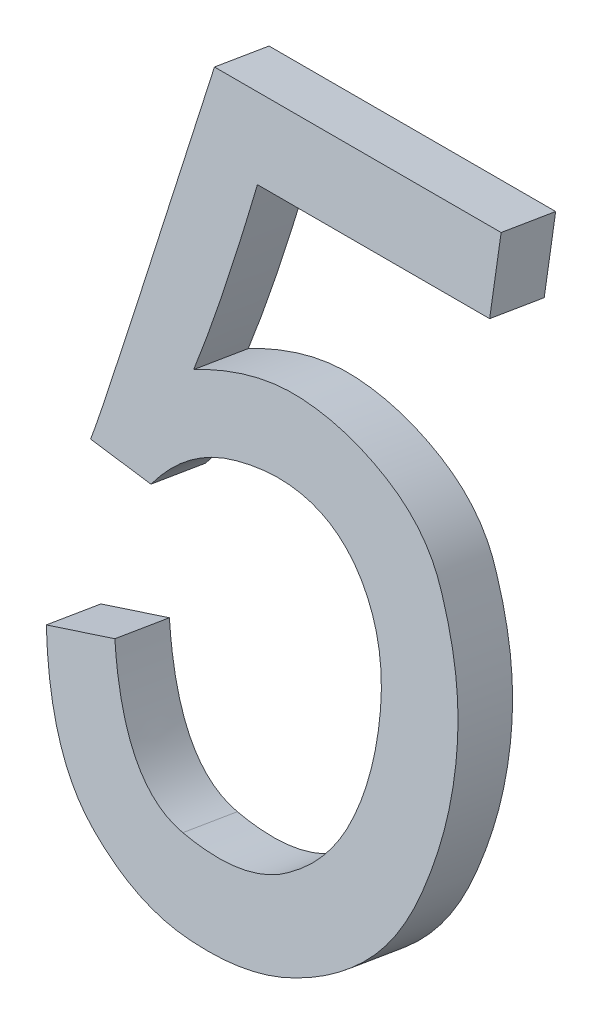
ISO-10303-21;
HEADER;
FILE_DESCRIPTION(('STEP AP214'),'2;1');
FILE_NAME('part.step','',(''),(''),'','','');
FILE_SCHEMA(('AUTOMOTIVE_DESIGN { 1 0 10303 214 1 1 1 1 }'));
ENDSEC;
DATA;
#1=APPLICATION_CONTEXT('core data for automotive mechanical design processes');
#2=APPLICATION_PROTOCOL_DEFINITION('international standard','automotive_design',2000,#1);
#3=PRODUCT_CONTEXT('',#1,'mechanical');
#4=PRODUCT('Part','Part','',(#3));
#5=PRODUCT_RELATED_PRODUCT_CATEGORY('part','',(#4));
#6=PRODUCT_DEFINITION_FORMATION('','',#4);
#7=PRODUCT_DEFINITION_CONTEXT('part definition',#1,'design');
#8=PRODUCT_DEFINITION('design','',#6,#7);
#9=PRODUCT_DEFINITION_SHAPE('','',#8);
#10=(LENGTH_UNIT() NAMED_UNIT(*) SI_UNIT(.MILLI.,.METRE.));
#11=(NAMED_UNIT(*) PLANE_ANGLE_UNIT() SI_UNIT($,.RADIAN.));
#12=(NAMED_UNIT(*) SI_UNIT($,.STERADIAN.) SOLID_ANGLE_UNIT());
#13=UNCERTAINTY_MEASURE_WITH_UNIT(LENGTH_MEASURE(1.E-05),#10,'distance_accuracy_value','');
#14=(GEOMETRIC_REPRESENTATION_CONTEXT(3) GLOBAL_UNCERTAINTY_ASSIGNED_CONTEXT((#13)) GLOBAL_UNIT_ASSIGNED_CONTEXT((#10,
#11,#12)) REPRESENTATION_CONTEXT('',''));
#15=CARTESIAN_POINT('',(0.,0.,0.));
#16=DIRECTION('',(0.,0.,1.));
#17=DIRECTION('',(1.,0.,0.));
#18=AXIS2_PLACEMENT_3D('',#15,#16,#17);
#19=CARTESIAN_POINT('',(1440.69351230425,1096.04138361752,1251.70115066223));
#20=CARTESIAN_POINT('',(1436.97762863534,1096.74208879472,1251.58436646603));
#21=CARTESIAN_POINT('',(1434.34451901566,1100.19371059353,1251.00909616622));
#22=CARTESIAN_POINT('',(1432.81879194631,1106.42220105754,1249.97101442222));
#23=B_SPLINE_CURVE_WITH_KNOTS('',3,(#19,#20,#21,#22),.UNSPECIFIED.,.F.,.F.,(4,4),(0.,
0.0340028100844146),.UNSPECIFIED.);
#24=DIRECTION('',(0.,-0.164398987305355,-0.986393923832144));
#25=VECTOR('',#24,1.);
#26=SURFACE_OF_LINEAR_EXTRUSION('',#23,#25);
#27=CARTESIAN_POINT('',(1440.69351230425,1095.21938868099,1246.76918104307));
#28=CARTESIAN_POINT('',(1436.97762863534,1095.9200938582,1246.65239684687));
#29=CARTESIAN_POINT('',(1434.34451901566,1099.371715657,1246.07712654706));
#30=CARTESIAN_POINT('',(1432.81879194631,1105.60020612102,1245.03904480306));
#31=B_SPLINE_CURVE_WITH_KNOTS('',3,(#27,#28,#29,#30),.UNSPECIFIED.,.F.,.F.,(4,4),(0.,
0.0340028100844146),.UNSPECIFIED.);
#32=CARTESIAN_POINT('',(1440.69351230425,1095.21938868099,1246.76918104307));
#33=VERTEX_POINT('',#32);
#34=CARTESIAN_POINT('',(1432.81879194631,1105.60020612102,1245.03904480306));
#35=VERTEX_POINT('',#34);
#36=EDGE_CURVE('E102',#33,#35,#31,.T.);
#37=ORIENTED_EDGE('',*,*,#36,.T.);
#38=DIRECTION('',(0.,-0.164398987305355,-0.986393923832144));
#39=VECTOR('',#38,1.);
#40=CARTESIAN_POINT('',(1432.81879194631,1106.42220105754,1249.97101442222));
#41=LINE('',#40,#39);
#42=CARTESIAN_POINT('',(1432.81879194631,1106.42220105754,1249.97101442222));
#43=VERTEX_POINT('',#42);
#44=EDGE_CURVE('E111',#43,#35,#41,.T.);
#45=ORIENTED_EDGE('',*,*,#44,.F.);
#46=CARTESIAN_POINT('',(1440.69351230425,1096.04138361752,1251.70115066223));
#47=VERTEX_POINT('',#46);
#48=EDGE_CURVE('E116',#47,#43,#23,.T.);
#49=ORIENTED_EDGE('',*,*,#48,.F.);
#50=DIRECTION('',(0.,-0.164398987305355,-0.986393923832144));
#51=VECTOR('',#50,1.);
#52=CARTESIAN_POINT('',(1440.69351230425,1096.04138361752,1251.70115066223));
#53=LINE('',#52,#51);
#54=EDGE_CURVE('E108',#47,#33,#53,.T.);
#55=ORIENTED_EDGE('',*,*,#54,.T.);
#56=EDGE_LOOP('',(#37,#45,#49,#55));
#57=FACE_BOUND('',#56,.T.);
#58=ADVANCED_FACE('F17',(#57),#26,.F.);
#59=CARTESIAN_POINT('',(1432.81879194631,1106.42220105754,1249.97101442222));
#60=DIRECTION('',(0.284040341246682,-0.94576665660509,0.157627776100846));
#61=DIRECTION('',(0.957739744636861,0.287636196510315,0.));
#62=AXIS2_PLACEMENT_3D('',#59,#60,#61);
#63=PLANE('',#62);
#64=CARTESIAN_POINT('',(1432.81879194631,1105.60020612102,1245.03904480306));
#65=CARTESIAN_POINT('',(1430.85011185682,1105.02493582121,1245.13492318636));
#66=CARTESIAN_POINT('',(1428.88143176733,1104.44966552141,1245.23080156966));
#67=CARTESIAN_POINT('',(1426.91275167785,1103.87439522161,1245.32667995296));
#68=B_SPLINE_CURVE_WITH_KNOTS('',3,(#64,#65,#66,#67),.UNSPECIFIED.,.F.,.F.,(4,4),
(0.0340028100844146,0.0490711736467914),.UNSPECIFIED.);
#69=CARTESIAN_POINT('',(1426.91275167785,1103.87439522161,1245.32667995296));
#70=VERTEX_POINT('',#69);
#71=EDGE_CURVE('E99',#35,#70,#68,.T.);
#72=ORIENTED_EDGE('',*,*,#71,.T.);
#73=DIRECTION('',(0.,-0.164398987305355,-0.986393923832144));
#74=VECTOR('',#73,1.);
#75=CARTESIAN_POINT('',(1426.91275167785,1104.69639015814,1250.25864957212));
#76=LINE('',#75,#74);
#77=CARTESIAN_POINT('',(1426.91275167785,1104.69639015814,1250.25864957212));
#78=VERTEX_POINT('',#77);
#79=EDGE_CURVE('E107',#78,#70,#76,.T.);
#80=ORIENTED_EDGE('',*,*,#79,.F.);
#81=CARTESIAN_POINT('',(1432.81879194631,1106.42220105754,1249.97101442222));
#82=CARTESIAN_POINT('',(1430.85011185682,1105.84693075774,1250.06689280552));
#83=CARTESIAN_POINT('',(1428.88143176733,1105.27166045794,1250.16277118882));
#84=CARTESIAN_POINT('',(1426.91275167785,1104.69639015814,1250.25864957212));
#85=B_SPLINE_CURVE_WITH_KNOTS('',3,(#81,#82,#83,#84),.UNSPECIFIED.,.F.,.F.,(4,4),
(0.0340028100844146,0.0490711736467914),.UNSPECIFIED.);
#86=EDGE_CURVE('E93',#43,#78,#85,.T.);
#87=ORIENTED_EDGE('',*,*,#86,.F.);
#88=ORIENTED_EDGE('',*,*,#44,.T.);
#89=EDGE_LOOP('',(#72,#80,#87,#88));
#90=FACE_BOUND('',#89,.T.);
#91=ADVANCED_FACE('F112',(#90),#63,.F.);
#92=CARTESIAN_POINT('',(1426.91275167785,1104.69639015814,1250.25864957212));
#93=CARTESIAN_POINT('',(1428.00782997763,1099.15562884953,1251.18210979022));
#94=CARTESIAN_POINT('',(1430.02572706935,1095.23687026592,1251.83523622083));
#95=CARTESIAN_POINT('',(1435.9317673378,1090.61740650511,1252.60514684763));
#96=CARTESIAN_POINT('',(1439.0447427293,1089.35873239051,1252.81492586673));
#97=CARTESIAN_POINT('',(1445.61521252796,1088.8915956057,1252.89278199753));
#98=CARTESIAN_POINT('',(1448.50671140939,1089.29385228151,1252.82573921823));
#99=CARTESIAN_POINT('',(1453.54097801974,1091.36570432355,1252.48043054456));
#100=CARTESIAN_POINT('',(1455.68008948546,1092.75845010211,1252.24830624813));
#101=CARTESIAN_POINT('',(1459.18108644327,1096.21658101471,1251.67195109603));
#102=CARTESIAN_POINT('',(1460.49105145414,1098.40301958513,1251.30754466763));
#103=CARTESIAN_POINT('',(1462.23439918214,1103.71144760114,1250.42280666496));
#104=CARTESIAN_POINT('',(1462.73042505593,1106.30541686134,1249.99047845492));
#105=CARTESIAN_POINT('',(1462.95133761782,1111.37906533773,1249.14487037553));
#106=CARTESIAN_POINT('',(1462.73042505593,1113.75365337456,1248.74910570272));
#107=CARTESIAN_POINT('',(1461.64695482275,1118.14236871265,1248.01765314637));
#108=CARTESIAN_POINT('',(1460.76174496644,1120.31952040537,1247.65479453092));
#109=CARTESIAN_POINT('',(1458.35011185682,1124.70541577378,1246.92381196952));
#110=CARTESIAN_POINT('',(1456.44295302013,1126.44420269499,1246.63401414932));
#111=CARTESIAN_POINT('',(1451.18148972587,1128.95927749624,1246.21483501577));
#112=CARTESIAN_POINT('',(1448.45749440716,1129.66225610139,1246.09767191491));
#113=CARTESIAN_POINT('',(1442.77293064877,1129.89582449379,1246.05874384951));
#114=CARTESIAN_POINT('',(1439.7091722595,1129.14321522939,1246.18417872691));
#115=CARTESIAN_POINT('',(1436.42393736018,1127.53418852619,1246.45234984411));
#116=B_SPLINE_CURVE_WITH_KNOTS('',3,(#92,#93,#94,#95,#96,#97,#98,#99,#100,#101,#102,#103,#104,
#105,#106,#107,#108,#109,#110,#111,#112,#113,#114,#115),.UNSPECIFIED.,.F.,.F.,(4,2,2,2,2,2,2,2,
2,2,2,4),(0.0490711736467914,0.0824983800715544,0.115925586496317,0.149352792921081,
0.182641166739371,0.216055091863988,0.249321536601,0.282418567879519,0.315558159509731,
0.348697751139945,0.381777485756295,0.414857220372645),.UNSPECIFIED.);
#117=DIRECTION('',(0.,-0.164398987305355,-0.986393923832144));
#118=VECTOR('',#117,1.);
#119=SURFACE_OF_LINEAR_EXTRUSION('',#116,#118);
#120=CARTESIAN_POINT('',(1426.91275167785,1103.87439522161,1245.32667995296));
#121=CARTESIAN_POINT('',(1428.00782997763,1098.333633913,1246.25014017106));
#122=CARTESIAN_POINT('',(1430.02572706935,1094.41487532939,1246.90326660167));
#123=CARTESIAN_POINT('',(1435.9317673378,1089.79541156858,1247.67317722847));
#124=CARTESIAN_POINT('',(1439.0447427293,1088.53673745398,1247.88295624757));
#125=CARTESIAN_POINT('',(1445.61521252796,1088.06960066918,1247.96081237837));
#126=CARTESIAN_POINT('',(1448.50671140939,1088.47185734498,1247.89376959907));
#127=CARTESIAN_POINT('',(1453.54097801974,1090.54370938702,1247.54846092539));
#128=CARTESIAN_POINT('',(1455.68008948546,1091.93645516559,1247.31633662897));
#129=CARTESIAN_POINT('',(1459.18108644327,1095.39458607818,1246.73998147687));
#130=CARTESIAN_POINT('',(1460.49105145414,1097.5810246486,1246.37557504846));
#131=CARTESIAN_POINT('',(1462.23439918214,1102.88945266461,1245.4908370458));
#132=CARTESIAN_POINT('',(1462.73042505593,1105.48342192482,1245.05850883576));
#133=CARTESIAN_POINT('',(1462.95133761782,1110.5570704012,1244.21290075636));
#134=CARTESIAN_POINT('',(1462.73042505593,1112.93165843803,1243.81713608356));
#135=CARTESIAN_POINT('',(1461.64695482275,1117.32037377612,1243.08568352721));
#136=CARTESIAN_POINT('',(1460.76174496644,1119.49752546885,1242.72282491176));
#137=CARTESIAN_POINT('',(1458.35011185682,1123.88342083726,1241.99184235035));
#138=CARTESIAN_POINT('',(1456.44295302013,1125.62220775846,1241.70204453015));
#139=CARTESIAN_POINT('',(1451.18148972587,1128.13728255971,1241.28286539661));
#140=CARTESIAN_POINT('',(1448.45749440716,1128.84026116487,1241.16570229575));
#141=CARTESIAN_POINT('',(1442.77293064877,1129.07382955727,1241.12677423035));
#142=CARTESIAN_POINT('',(1439.7091722595,1128.32122029287,1241.25220910775));
#143=CARTESIAN_POINT('',(1436.42393736018,1126.71219358966,1241.52038022495));
#144=B_SPLINE_CURVE_WITH_KNOTS('',3,(#120,#121,#122,#123,#124,#125,#126,#127,#128,#129,#130,
#131,#132,#133,#134,#135,#136,#137,#138,#139,#140,#141,#142,#143),.UNSPECIFIED.,.F.,.F.,(4,2,2,
2,2,2,2,2,2,2,2,4),(0.0490711736467914,0.0824983800715544,0.115925586496317,0.149352792921081,
0.182641166739371,0.216055091863988,0.249321536601,0.282418567879519,0.315558159509731,
0.348697751139945,0.381777485756295,0.414857220372645),.UNSPECIFIED.);
#145=CARTESIAN_POINT('',(1436.42393736018,1126.71219358966,1241.52038022495));
#146=VERTEX_POINT('',#145);
#147=EDGE_CURVE('E104',#70,#146,#144,.T.);
#148=ORIENTED_EDGE('',*,*,#147,.T.);
#149=DIRECTION('',(0.,-0.164398987305355,-0.986393923832144));
#150=VECTOR('',#149,1.);
#151=CARTESIAN_POINT('',(1436.42393736018,1127.53418852619,1246.45234984411));
#152=LINE('',#151,#150);
#153=CARTESIAN_POINT('',(1436.42393736018,1127.53418852619,1246.45234984411));
#154=VERTEX_POINT('',#153);
#155=EDGE_CURVE('E195',#154,#146,#152,.T.);
#156=ORIENTED_EDGE('',*,*,#155,.F.);
#157=EDGE_CURVE('E185',#78,#154,#116,.T.);
#158=ORIENTED_EDGE('',*,*,#157,.F.);
#159=ORIENTED_EDGE('',*,*,#79,.T.);
#160=EDGE_LOOP('',(#148,#156,#158,#159));
#161=FACE_BOUND('',#160,.T.);
#162=ADVANCED_FACE('F146',(#161),#119,.F.);
#163=CARTESIAN_POINT('',(1436.42393736018,1127.53418852619,1246.45234984411));
#164=CARTESIAN_POINT('',(1437.51901565995,1131.2193787174,1245.83815147891));
#165=CARTESIAN_POINT('',(1438.61409395973,1136.18919506681,1245.00984875401));
#166=CARTESIAN_POINT('',(1439.7091722595,1142.41768553082,1243.97176701001));
#167=B_SPLINE_CURVE_WITH_KNOTS('',3,(#163,#164,#165,#166),.UNSPECIFIED.,.F.,.F.,(4,4),
(0.414857220372645,0.469693488197427),.UNSPECIFIED.);
#168=DIRECTION('',(0.,-0.164398987305355,-0.986393923832144));
#169=VECTOR('',#168,1.);
#170=SURFACE_OF_LINEAR_EXTRUSION('',#167,#169);
#171=CARTESIAN_POINT('',(1436.42393736018,1126.71219358966,1241.52038022495));
#172=CARTESIAN_POINT('',(1437.51901565995,1130.39738378087,1240.90618185975));
#173=CARTESIAN_POINT('',(1438.61409395973,1135.36720013028,1240.07787913485));
#174=CARTESIAN_POINT('',(1439.7091722595,1141.59569059429,1239.03979739085));
#175=B_SPLINE_CURVE_WITH_KNOTS('',3,(#171,#172,#173,#174),.UNSPECIFIED.,.F.,.F.,(4,4),
(0.414857220372645,0.469693488197427),.UNSPECIFIED.);
#176=CARTESIAN_POINT('',(1439.7091722595,1141.59569059429,1239.03979739085));
#177=VERTEX_POINT('',#176);
#178=EDGE_CURVE('E182',#146,#177,#175,.T.);
#179=ORIENTED_EDGE('',*,*,#178,.T.);
#180=DIRECTION('',(0.,-0.164398987305355,-0.986393923832144));
#181=VECTOR('',#180,1.);
#182=CARTESIAN_POINT('',(1439.7091722595,1142.41768553082,1243.97176701001));
#183=LINE('',#182,#181);
#184=CARTESIAN_POINT('',(1439.7091722595,1142.41768553082,1243.97176701001));
#185=VERTEX_POINT('',#184);
#186=EDGE_CURVE('E174',#185,#177,#183,.T.);
#187=ORIENTED_EDGE('',*,*,#186,.F.);
#188=EDGE_CURVE('E169',#154,#185,#167,.T.);
#189=ORIENTED_EDGE('',*,*,#188,.F.);
#190=ORIENTED_EDGE('',*,*,#155,.T.);
#191=EDGE_LOOP('',(#179,#187,#189,#190));
#192=FACE_BOUND('',#191,.T.);
#193=ADVANCED_FACE('F149',(#192),#170,.F.);
#194=CARTESIAN_POINT('',(1439.7091722595,1142.41768553082,1243.97176701001));
#195=DIRECTION('',(0.,0.986393923832144,-0.164398987305355));
#196=DIRECTION('',(0.,0.164398987305355,0.986393923832144));
#197=AXIS2_PLACEMENT_3D('',#194,#195,#196);
#198=PLANE('',#197);
#199=CARTESIAN_POINT('',(1439.7091722595,1141.59569059429,1239.03979739085));
#200=CARTESIAN_POINT('',(1446.70618941088,1141.59569059429,1239.03979739085));
#201=CARTESIAN_POINT('',(1453.70320656226,1141.59569059429,1239.03979739085));
#202=CARTESIAN_POINT('',(1460.70022371364,1141.59569059429,1239.03979739085));
#203=B_SPLINE_CURVE_WITH_KNOTS('',3,(#199,#200,#201,#202),.UNSPECIFIED.,.F.,.F.,(4,4),
(0.469693488197427,0.544197028152463),.UNSPECIFIED.);
#204=CARTESIAN_POINT('',(1460.70022371364,1141.59569059429,1239.03979739085));
#205=VERTEX_POINT('',#204);
#206=EDGE_CURVE('E173',#177,#205,#203,.T.);
#207=ORIENTED_EDGE('',*,*,#206,.T.);
#208=DIRECTION('',(0.,-0.164398987305355,-0.986393923832144));
#209=VECTOR('',#208,1.);
#210=CARTESIAN_POINT('',(1460.70022371364,1142.41768553082,1243.97176701001));
#211=LINE('',#210,#209);
#212=CARTESIAN_POINT('',(1460.70022371364,1142.41768553082,1243.97176701001));
#213=VERTEX_POINT('',#212);
#214=EDGE_CURVE('E466',#213,#205,#211,.T.);
#215=ORIENTED_EDGE('',*,*,#214,.F.);
#216=CARTESIAN_POINT('',(1439.7091722595,1142.41768553082,1243.97176701001));
#217=CARTESIAN_POINT('',(1446.70618941088,1142.41768553082,1243.97176701001));
#218=CARTESIAN_POINT('',(1453.70320656226,1142.41768553082,1243.97176701001));
#219=CARTESIAN_POINT('',(1460.70022371364,1142.41768553082,1243.97176701001));
#220=B_SPLINE_CURVE_WITH_KNOTS('',3,(#216,#217,#218,#219),.UNSPECIFIED.,.F.,.F.,(4,4),
(0.469693488197427,0.544197028152463),.UNSPECIFIED.);
#221=EDGE_CURVE('E457',#185,#213,#220,.T.);
#222=ORIENTED_EDGE('',*,*,#221,.F.);
#223=ORIENTED_EDGE('',*,*,#186,.T.);
#224=EDGE_LOOP('',(#207,#215,#222,#223));
#225=FACE_BOUND('',#224,.T.);
#226=ADVANCED_FACE('F153',(#225),#198,.F.);
#227=CARTESIAN_POINT('',(1460.70022371364,1142.41768553082,1243.97176701001));
#228=DIRECTION('',(-1.,0.,0.));
#229=DIRECTION('',(0.,0.,1.));
#230=AXIS2_PLACEMENT_3D('',#227,#228,#229);
#231=PLANE('',#230);
#232=CARTESIAN_POINT('',(1460.70022371364,1141.59569059429,1239.03979739085));
#233=CARTESIAN_POINT('',(1460.70022371364,1143.6718540823,1238.69377014285));
#234=CARTESIAN_POINT('',(1460.70022371364,1145.7480175703,1238.34774289485));
#235=CARTESIAN_POINT('',(1460.70022371364,1147.82418105831,1238.00171564685));
#236=B_SPLINE_CURVE_WITH_KNOTS('',3,(#232,#233,#234,#235),.UNSPECIFIED.,.F.,.F.,(4,4),
(0.544197028152463,0.566608745190747),.UNSPECIFIED.);
#237=CARTESIAN_POINT('',(1460.70022371364,1147.82418105831,1238.00171564685));
#238=VERTEX_POINT('',#237);
#239=EDGE_CURVE('E455',#205,#238,#236,.T.);
#240=ORIENTED_EDGE('',*,*,#239,.T.);
#241=DIRECTION('',(0.,-0.164398987305355,-0.986393923832144));
#242=VECTOR('',#241,1.);
#243=CARTESIAN_POINT('',(1460.70022371364,1148.64617599483,1242.93368526601));
#244=LINE('',#243,#242);
#245=CARTESIAN_POINT('',(1460.70022371364,1148.64617599483,1242.93368526601));
#246=VERTEX_POINT('',#245);
#247=EDGE_CURVE('E444',#246,#238,#244,.T.);
#248=ORIENTED_EDGE('',*,*,#247,.F.);
#249=CARTESIAN_POINT('',(1460.70022371364,1142.41768553082,1243.97176701001));
#250=CARTESIAN_POINT('',(1460.70022371364,1144.49384901883,1243.62573976201));
#251=CARTESIAN_POINT('',(1460.70022371364,1146.57001250683,1243.27971251401));
#252=CARTESIAN_POINT('',(1460.70022371364,1148.64617599483,1242.93368526601));
#253=B_SPLINE_CURVE_WITH_KNOTS('',3,(#249,#250,#251,#252),.UNSPECIFIED.,.F.,.F.,(4,4),
(0.544197028152463,0.566608745190747),.UNSPECIFIED.);
#254=EDGE_CURVE('E435',#213,#246,#253,.T.);
#255=ORIENTED_EDGE('',*,*,#254,.F.);
#256=ORIENTED_EDGE('',*,*,#214,.T.);
#257=EDGE_LOOP('',(#240,#248,#255,#256));
#258=FACE_BOUND('',#257,.T.);
#259=ADVANCED_FACE('F270',(#258),#231,.F.);
#260=CARTESIAN_POINT('',(1460.70022371364,1148.64617599483,1242.93368526601));
#261=DIRECTION('',(0.,-0.986393923832144,0.164398987305355));
#262=DIRECTION('',(0.,-0.164398987305355,-0.986393923832144));
#263=AXIS2_PLACEMENT_3D('',#260,#261,#262);
#264=PLANE('',#263);
#265=CARTESIAN_POINT('',(1460.70022371364,1147.82418105831,1238.00171564685));
#266=CARTESIAN_POINT('',(1452.06263982103,1147.82418105831,1238.00171564685));
#267=CARTESIAN_POINT('',(1443.42505592841,1147.82418105831,1238.00171564685));
#268=CARTESIAN_POINT('',(1434.78747203579,1147.82418105831,1238.00171564685));
#269=B_SPLINE_CURVE_WITH_KNOTS('',3,(#265,#266,#267,#268),.UNSPECIFIED.,.F.,.F.,(4,4),
(0.566608745190747,0.658580875991044),.UNSPECIFIED.);
#270=CARTESIAN_POINT('',(1434.78747203579,1147.82418105831,1238.00171564685));
#271=VERTEX_POINT('',#270);
#272=EDGE_CURVE('E433',#238,#271,#269,.T.);
#273=ORIENTED_EDGE('',*,*,#272,.T.);
#274=DIRECTION('',(0.,-0.164398987305355,-0.986393923832144));
#275=VECTOR('',#274,1.);
#276=CARTESIAN_POINT('',(1434.78747203579,1148.64617599483,1242.93368526601));
#277=LINE('',#276,#275);
#278=CARTESIAN_POINT('',(1434.78747203579,1148.64617599483,1242.93368526601));
#279=VERTEX_POINT('',#278);
#280=EDGE_CURVE('E422',#279,#271,#277,.T.);
#281=ORIENTED_EDGE('',*,*,#280,.F.);
#282=CARTESIAN_POINT('',(1460.70022371364,1148.64617599483,1242.93368526601));
#283=CARTESIAN_POINT('',(1452.06263982103,1148.64617599483,1242.93368526601));
#284=CARTESIAN_POINT('',(1443.42505592841,1148.64617599483,1242.93368526601));
#285=CARTESIAN_POINT('',(1434.78747203579,1148.64617599483,1242.93368526601));
#286=B_SPLINE_CURVE_WITH_KNOTS('',3,(#282,#283,#284,#285),.UNSPECIFIED.,.F.,.F.,(4,4),
(0.566608745190747,0.658580875991044),.UNSPECIFIED.);
#287=EDGE_CURVE('E413',#246,#279,#286,.T.);
#288=ORIENTED_EDGE('',*,*,#287,.F.);
#289=ORIENTED_EDGE('',*,*,#247,.T.);
#290=EDGE_LOOP('',(#273,#281,#288,#289));
#291=FACE_BOUND('',#290,.T.);
#292=ADVANCED_FACE('F280',(#291),#264,.F.);
#293=CARTESIAN_POINT('',(1434.78747203579,1148.64617599483,1242.93368526601));
#294=CARTESIAN_POINT('',(1431.05928411633,1130.18129697339,1246.01116510291));
#295=CARTESIAN_POINT('',(1428.99217002237,1120.26761631817,1247.66344521212));
#296=CARTESIAN_POINT('',(1428.54921700223,1118.87918198557,1247.89485093422));
#297=B_SPLINE_CURVE_WITH_KNOTS('',3,(#293,#294,#295,#296),.UNSPECIFIED.,.F.,.F.,(4,4),
(0.658580875991044,0.767962251309394),.UNSPECIFIED.);
#298=DIRECTION('',(0.,-0.164398987305355,-0.986393923832144));
#299=VECTOR('',#298,1.);
#300=SURFACE_OF_LINEAR_EXTRUSION('',#297,#299);
#301=CARTESIAN_POINT('',(1434.78747203579,1147.82418105831,1238.00171564685));
#302=CARTESIAN_POINT('',(1431.05928411633,1129.35930203687,1241.07919548375));
#303=CARTESIAN_POINT('',(1428.99217002237,1119.44562138165,1242.73147559296));
#304=CARTESIAN_POINT('',(1428.54921700223,1118.05718704904,1242.96288131506));
#305=B_SPLINE_CURVE_WITH_KNOTS('',3,(#301,#302,#303,#304),.UNSPECIFIED.,.F.,.F.,(4,4),
(0.658580875991044,0.767962251309394),.UNSPECIFIED.);
#306=CARTESIAN_POINT('',(1428.54921700223,1118.05718704904,1242.96288131506));
#307=VERTEX_POINT('',#306);
#308=EDGE_CURVE('E411',#271,#307,#305,.T.);
#309=ORIENTED_EDGE('',*,*,#308,.T.);
#310=DIRECTION('',(0.,-0.164398987305355,-0.986393923832144));
#311=VECTOR('',#310,1.);
#312=CARTESIAN_POINT('',(1428.54921700223,1118.87918198557,1247.89485093422));
#313=LINE('',#312,#311);
#314=CARTESIAN_POINT('',(1428.54921700223,1118.87918198557,1247.89485093422));
#315=VERTEX_POINT('',#314);
#316=EDGE_CURVE('E407',#315,#307,#313,.T.);
#317=ORIENTED_EDGE('',*,*,#316,.F.);
#318=EDGE_CURVE('E398',#279,#315,#297,.T.);
#319=ORIENTED_EDGE('',*,*,#318,.F.);
#320=ORIENTED_EDGE('',*,*,#280,.T.);
#321=EDGE_LOOP('',(#309,#317,#319,#320));
#322=FACE_BOUND('',#321,.T.);
#323=ADVANCED_FACE('F291',(#322),#300,.F.);
#324=CARTESIAN_POINT('',(1428.54921700223,1118.87918198557,1247.89485093422));
#325=DIRECTION('',(0.124120156079134,0.978766332255105,-0.163127722042516));
#326=DIRECTION('',(0.,0.164398987305355,0.986393923832144));
#327=AXIS2_PLACEMENT_3D('',#324,#325,#326);
#328=PLANE('',#327);
#329=CARTESIAN_POINT('',(1428.54921700223,1118.05718704904,1242.96288131506));
#330=CARTESIAN_POINT('',(1430.40715883669,1117.82794399724,1243.00108849036));
#331=CARTESIAN_POINT('',(1432.26510067114,1117.59870094544,1243.03929566566));
#332=CARTESIAN_POINT('',(1434.12304250559,1117.36945789364,1243.07750284096));
#333=B_SPLINE_CURVE_WITH_KNOTS('',3,(#329,#330,#331,#332),.UNSPECIFIED.,.F.,.F.,(4,4),
(0.767962251309394,0.787899602081544),.UNSPECIFIED.);
#334=CARTESIAN_POINT('',(1434.12304250559,1117.36945789364,1243.07750284096));
#335=VERTEX_POINT('',#334);
#336=EDGE_CURVE('E396',#307,#335,#333,.T.);
#337=ORIENTED_EDGE('',*,*,#336,.T.);
#338=DIRECTION('',(0.,-0.164398987305355,-0.986393923832144));
#339=VECTOR('',#338,1.);
#340=CARTESIAN_POINT('',(1434.12304250559,1118.19145283017,1248.00947246012));
#341=LINE('',#340,#339);
#342=CARTESIAN_POINT('',(1434.12304250559,1118.19145283017,1248.00947246012));
#343=VERTEX_POINT('',#342);
#344=EDGE_CURVE('E377',#343,#335,#341,.T.);
#345=ORIENTED_EDGE('',*,*,#344,.F.);
#346=CARTESIAN_POINT('',(1428.54921700223,1118.87918198557,1247.89485093422));
#347=CARTESIAN_POINT('',(1430.40715883669,1118.64993893377,1247.93305810952));
#348=CARTESIAN_POINT('',(1432.26510067114,1118.42069588197,1247.97126528482));
#349=CARTESIAN_POINT('',(1434.12304250559,1118.19145283017,1248.00947246012));
#350=B_SPLINE_CURVE_WITH_KNOTS('',3,(#346,#347,#348,#349),.UNSPECIFIED.,.F.,.F.,(4,4),
(0.767962251309394,0.787899602081544),.UNSPECIFIED.);
#351=EDGE_CURVE('E38',#315,#343,#350,.T.);
#352=ORIENTED_EDGE('',*,*,#351,.F.);
#353=ORIENTED_EDGE('',*,*,#316,.T.);
#354=EDGE_LOOP('',(#337,#345,#352,#353));
#355=FACE_BOUND('',#354,.T.);
#356=ADVANCED_FACE('F303',(#355),#328,.F.);
#357=CARTESIAN_POINT('',(1434.12304250559,1118.19145283017,1248.00947246012));
#358=CARTESIAN_POINT('',(1435.88255033557,1120.73475310297,1247.58558908132));
#359=CARTESIAN_POINT('',(1438.12192393736,1122.34377980618,1247.31741796412));
#360=CARTESIAN_POINT('',(1443.58819145773,1123.72003882387,1247.08804146117));
#361=CARTESIAN_POINT('',(1446.04586129754,1123.73221413878,1247.08601224202));
#362=CARTESIAN_POINT('',(1450.422346254,1122.33202856869,1247.3193765037));
#363=CARTESIAN_POINT('',(1452.23489932886,1120.95534547357,1247.54882368622));
#364=CARTESIAN_POINT('',(1455.06871831142,1116.7973822136,1248.24181756288));
#365=CARTESIAN_POINT('',(1455.84004474273,1114.27269424656,1248.66259889072));
#366=CARTESIAN_POINT('',(1456.06152125279,1108.27777217495,1249.66175256932));
#367=CARTESIAN_POINT('',(1455.61856823266,1105.56578361874,1250.11375066202));
#368=CARTESIAN_POINT('',(1453.64988814317,1100.71275146553,1250.92258935422));
#369=CARTESIAN_POINT('',(1452.01342281879,1098.75337217373,1251.24915256953));
#370=CARTESIAN_POINT('',(1447.40557604036,1095.76495885496,1251.74722145599));
#371=CARTESIAN_POINT('',(1444.40939597315,1095.35365446212,1251.81577218813));
#372=CARTESIAN_POINT('',(1440.69351230425,1096.04138361752,1251.70115066223));
#373=B_SPLINE_CURVE_WITH_KNOTS('',3,(#357,#358,#359,#360,#361,#362,#363,#364,#365,#366,#367,
#368,#369,#370,#371,#372),.UNSPECIFIED.,.F.,.F.,(4,2,2,2,2,2,2,4),(0.787899602081544,
0.818148984340229,0.848433585243807,0.878665250754308,0.908978987957478,0.939292725160649,
0.969606462363817,1.),.UNSPECIFIED.);
#374=DIRECTION('',(0.,-0.164398987305355,-0.986393923832144));
#375=VECTOR('',#374,1.);
#376=SURFACE_OF_LINEAR_EXTRUSION('',#373,#375);
#377=CARTESIAN_POINT('',(1434.12304250559,1117.36945789364,1243.07750284096));
#378=CARTESIAN_POINT('',(1435.88255033557,1119.91275816645,1242.65361946216));
#379=CARTESIAN_POINT('',(1438.12192393736,1121.52178486965,1242.38544834496));
#380=CARTESIAN_POINT('',(1443.58819145773,1122.89804388735,1242.15607184201));
#381=CARTESIAN_POINT('',(1446.04586129754,1122.91021920225,1242.15404262286));
#382=CARTESIAN_POINT('',(1450.422346254,1121.51003363216,1242.38740688454));
#383=CARTESIAN_POINT('',(1452.23489932886,1120.13335053705,1242.61685406706));
#384=CARTESIAN_POINT('',(1455.06871831142,1115.97538727707,1243.30984794372));
#385=CARTESIAN_POINT('',(1455.84004474273,1113.45069931003,1243.73062927156));
#386=CARTESIAN_POINT('',(1456.06152125279,1107.45577723842,1244.72978295016));
#387=CARTESIAN_POINT('',(1455.61856823266,1104.74378868221,1245.18178104286));
#388=CARTESIAN_POINT('',(1453.64988814317,1099.890756529,1245.99061973506));
#389=CARTESIAN_POINT('',(1452.01342281879,1097.9313772372,1246.31718295036));
#390=CARTESIAN_POINT('',(1447.40557604036,1094.94296391843,1246.81525183683));
#391=CARTESIAN_POINT('',(1444.40939597315,1094.53165952559,1246.88380256897));
#392=CARTESIAN_POINT('',(1440.69351230425,1095.21938868099,1246.76918104307));
#393=B_SPLINE_CURVE_WITH_KNOTS('',3,(#377,#378,#379,#380,#381,#382,#383,#384,#385,#386,#387,
#388,#389,#390,#391,#392),.UNSPECIFIED.,.F.,.F.,(4,2,2,2,2,2,2,4),(0.787899602081544,
0.818148984340229,0.848433585243807,0.878665250754308,0.908978987957478,0.939292725160649,
0.969606462363817,1.),.UNSPECIFIED.);
#394=EDGE_CURVE('E30',#335,#33,#393,.T.);
#395=ORIENTED_EDGE('',*,*,#394,.T.);
#396=ORIENTED_EDGE('',*,*,#54,.F.);
#397=EDGE_CURVE('E11',#343,#47,#373,.T.);
#398=ORIENTED_EDGE('',*,*,#397,.F.);
#399=ORIENTED_EDGE('',*,*,#344,.T.);
#400=EDGE_LOOP('',(#395,#396,#398,#399));
#401=FACE_BOUND('',#400,.T.);
#402=ADVANCED_FACE('F233',(#401),#376,.F.);
#403=CARTESIAN_POINT('',(1435.93484340044,1099.15887285498,1251.18156912265));
#404=DIRECTION('',(1.03443517901807E-13,0.164398987305485,0.986393923832122));
#405=DIRECTION('',(0.,-0.986393923832123,0.164398987305485));
#406=AXIS2_PLACEMENT_3D('',#403,#404,#405);
#407=PLANE('',#406);
#408=ORIENTED_EDGE('',*,*,#48,.T.);
#409=ORIENTED_EDGE('',*,*,#86,.T.);
#410=ORIENTED_EDGE('',*,*,#157,.T.);
#411=ORIENTED_EDGE('',*,*,#188,.T.);
#412=ORIENTED_EDGE('',*,*,#221,.T.);
#413=ORIENTED_EDGE('',*,*,#254,.T.);
#414=ORIENTED_EDGE('',*,*,#287,.T.);
#415=ORIENTED_EDGE('',*,*,#318,.T.);
#416=ORIENTED_EDGE('',*,*,#351,.T.);
#417=ORIENTED_EDGE('',*,*,#397,.T.);
#418=EDGE_LOOP('',(#408,#409,#410,#411,#412,#413,#414,#415,#416,#417));
#419=FACE_BOUND('',#418,.T.);
#420=ADVANCED_FACE('F228',(#419),#407,.T.);
#421=CARTESIAN_POINT('',(1435.93484340044,1098.33687791845,1246.24959950349));
#422=DIRECTION('',(1.03443517901807E-13,0.164398987305485,0.986393923832122));
#423=DIRECTION('',(0.,-0.986393923832123,0.164398987305485));
#424=AXIS2_PLACEMENT_3D('',#421,#422,#423);
#425=PLANE('',#424);
#426=ORIENTED_EDGE('',*,*,#36,.F.);
#427=ORIENTED_EDGE('',*,*,#394,.F.);
#428=ORIENTED_EDGE('',*,*,#336,.F.);
#429=ORIENTED_EDGE('',*,*,#308,.F.);
#430=ORIENTED_EDGE('',*,*,#272,.F.);
#431=ORIENTED_EDGE('',*,*,#239,.F.);
#432=ORIENTED_EDGE('',*,*,#206,.F.);
#433=ORIENTED_EDGE('',*,*,#178,.F.);
#434=ORIENTED_EDGE('',*,*,#147,.F.);
#435=ORIENTED_EDGE('',*,*,#71,.F.);
#436=EDGE_LOOP('',(#426,#427,#428,#429,#430,#431,#432,#433,#434,#435));
#437=FACE_BOUND('',#436,.T.);
#438=ADVANCED_FACE('F19',(#437),#425,.F.);
#439=CLOSED_SHELL('',(#58,#91,#162,#193,#226,#259,#292,#323,#356,#402,#420,#438));
#440=MANIFOLD_SOLID_BREP('B1',#439);
#441=ADVANCED_BREP_SHAPE_REPRESENTATION('',(#18,#440),#14);
#442=SHAPE_DEFINITION_REPRESENTATION(#9,#441);
ENDSEC;
END-ISO-10303-21;
